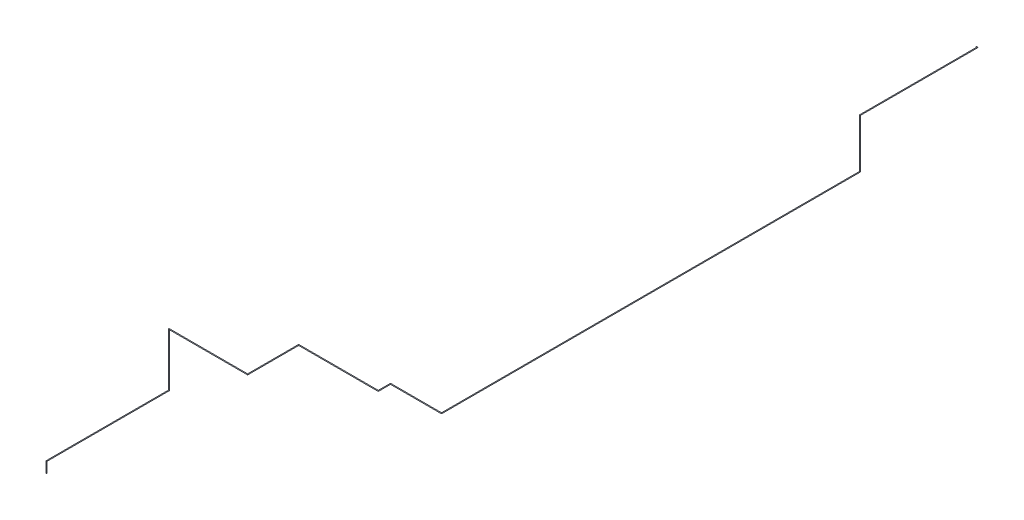
ISO-10303-21;
HEADER;
FILE_DESCRIPTION(('STEP AP214'),'2;1');
FILE_NAME('part.step','',(''),(''),'','','');
FILE_SCHEMA(('AUTOMOTIVE_DESIGN { 1 0 10303 214 1 1 1 1 }'));
ENDSEC;
DATA;
#1=APPLICATION_CONTEXT('core data for automotive mechanical design processes');
#2=APPLICATION_PROTOCOL_DEFINITION('international standard','automotive_design',2000,#1);
#3=PRODUCT_CONTEXT('',#1,'mechanical');
#4=PRODUCT('Part','Part','',(#3));
#5=PRODUCT_RELATED_PRODUCT_CATEGORY('part','',(#4));
#6=PRODUCT_DEFINITION_FORMATION('','',#4);
#7=PRODUCT_DEFINITION_CONTEXT('part definition',#1,'design');
#8=PRODUCT_DEFINITION('design','',#6,#7);
#9=PRODUCT_DEFINITION_SHAPE('','',#8);
#10=(LENGTH_UNIT() NAMED_UNIT(*) SI_UNIT(.MILLI.,.METRE.));
#11=(NAMED_UNIT(*) PLANE_ANGLE_UNIT() SI_UNIT($,.RADIAN.));
#12=(NAMED_UNIT(*) SI_UNIT($,.STERADIAN.) SOLID_ANGLE_UNIT());
#13=UNCERTAINTY_MEASURE_WITH_UNIT(LENGTH_MEASURE(1.E-05),#10,'distance_accuracy_value','');
#14=(GEOMETRIC_REPRESENTATION_CONTEXT(3) GLOBAL_UNCERTAINTY_ASSIGNED_CONTEXT((#13)) GLOBAL_UNIT_ASSIGNED_CONTEXT((#10,
#11,#12)) REPRESENTATION_CONTEXT('',''));
#15=CARTESIAN_POINT('',(0.,0.,0.));
#16=DIRECTION('',(0.,0.,1.));
#17=DIRECTION('',(1.,0.,0.));
#18=AXIS2_PLACEMENT_3D('',#15,#16,#17);
#19=CARTESIAN_POINT('',(0.,20.,0.));
#20=DIRECTION('',(0.,-1.,0.));
#21=DIRECTION('',(0.,0.,-1.));
#22=AXIS2_PLACEMENT_3D('',#19,#20,#21);
#23=CYLINDRICAL_SURFACE('',#22,12.7);
#24=CARTESIAN_POINT('',(0.,20.,0.));
#25=DIRECTION('',(0.,1.,0.));
#26=DIRECTION('',(0.,0.,1.));
#27=AXIS2_PLACEMENT_3D('',#24,#25,#26);
#28=CIRCLE('',#27,12.7);
#29=CARTESIAN_POINT('',(0.,20.,12.7));
#30=VERTEX_POINT('',#29);
#31=EDGE_CURVE('E41',#30,#30,#28,.T.);
#32=ORIENTED_EDGE('',*,*,#31,.F.);
#33=EDGE_LOOP('',(#32));
#34=FACE_BOUND('',#33,.T.);
#35=CARTESIAN_POINT('',(0.,5.,0.));
#36=DIRECTION('',(0.,1.,0.));
#37=DIRECTION('',(0.,0.,1.));
#38=AXIS2_PLACEMENT_3D('',#35,#36,#37);
#39=CIRCLE('',#38,12.7);
#40=CARTESIAN_POINT('',(-0.255798865635346,5.,12.6974236339637));
#41=VERTEX_POINT('',#40);
#42=CARTESIAN_POINT('',(0.255798865635346,5.,12.6974236339637));
#43=VERTEX_POINT('',#42);
#44=EDGE_CURVE('E11',#41,#43,#39,.T.);
#45=ORIENTED_EDGE('',*,*,#44,.T.);
#46=DIRECTION('',(0.,-1.,0.));
#47=VECTOR('',#46,1.);
#48=CARTESIAN_POINT('',(0.255798865635346,20.,12.6974236339637));
#49=LINE('',#48,#47);
#50=CARTESIAN_POINT('',(0.255798865635346,0.,12.6974236339637));
#51=VERTEX_POINT('',#50);
#52=EDGE_CURVE('E116',#43,#51,#49,.T.);
#53=ORIENTED_EDGE('',*,*,#52,.T.);
#54=CARTESIAN_POINT('',(0.,0.,0.));
#55=DIRECTION('',(0.,1.,0.));
#56=DIRECTION('',(0.,0.,1.));
#57=AXIS2_PLACEMENT_3D('',#54,#55,#56);
#58=CIRCLE('',#57,12.7);
#59=CARTESIAN_POINT('',(-0.255798865635346,0.,12.6974236339637));
#60=VERTEX_POINT('',#59);
#61=EDGE_CURVE('E152',#51,#60,#58,.T.);
#62=ORIENTED_EDGE('',*,*,#61,.T.);
#63=DIRECTION('',(0.,-1.,0.));
#64=VECTOR('',#63,1.);
#65=CARTESIAN_POINT('',(-0.255798865635346,20.,12.6974236339637));
#66=LINE('',#65,#64);
#67=EDGE_CURVE('E51',#60,#41,#66,.F.);
#68=ORIENTED_EDGE('',*,*,#67,.T.);
#69=EDGE_LOOP('',(#45,#53,#62,#68));
#70=FACE_BOUND('',#69,.T.);
#71=ADVANCED_FACE('F34',(#34,#70),#23,.T.);
#72=CARTESIAN_POINT('',(0.,0.,0.));
#73=DIRECTION('',(0.,1.,0.));
#74=DIRECTION('',(0.,0.,1.));
#75=AXIS2_PLACEMENT_3D('',#72,#73,#74);
#76=PLANE('',#75);
#77=ORIENTED_EDGE('',*,*,#61,.F.);
#78=DIRECTION('',(0.,0.,1.));
#79=VECTOR('',#78,1.);
#80=CARTESIAN_POINT('',(0.255798865635346,0.,12.4823290449341));
#81=LINE('',#80,#79);
#82=CARTESIAN_POINT('',(0.255798865635346,0.,12.9176709550659));
#83=VERTEX_POINT('',#82);
#84=EDGE_CURVE('E136',#51,#83,#81,.T.);
#85=ORIENTED_EDGE('',*,*,#84,.T.);
#86=DIRECTION('',(-1.,0.,0.));
#87=VECTOR('',#86,1.);
#88=CARTESIAN_POINT('',(-0.255798865635346,0.,12.9176709550659));
#89=LINE('',#88,#87);
#90=CARTESIAN_POINT('',(-0.255798865635346,0.,12.9176709550659));
#91=VERTEX_POINT('',#90);
#92=EDGE_CURVE('E126',#83,#91,#89,.T.);
#93=ORIENTED_EDGE('',*,*,#92,.T.);
#94=DIRECTION('',(0.,0.,-1.));
#95=VECTOR('',#94,1.);
#96=CARTESIAN_POINT('',(-0.255798865635346,0.,12.4823290449341));
#97=LINE('',#96,#95);
#98=EDGE_CURVE('E120',#91,#60,#97,.T.);
#99=ORIENTED_EDGE('',*,*,#98,.T.);
#100=EDGE_LOOP('',(#77,#85,#93,#99));
#101=FACE_BOUND('',#100,.T.);
#102=ADVANCED_FACE('F188',(#101),#76,.F.);
#103=CARTESIAN_POINT('',(10210.,5520.,-35355.));
#104=DIRECTION('',(-1.,0.,0.));
#105=DIRECTION('',(0.,0.,-1.));
#106=AXIS2_PLACEMENT_3D('',#103,#104,#105);
#107=PLANE('',#106);
#108=CARTESIAN_POINT('',(10210.,5520.,-35355.));
#109=DIRECTION('',(-1.,0.,0.));
#110=DIRECTION('',(0.,0.,-1.));
#111=AXIS2_PLACEMENT_3D('',#108,#109,#110);
#112=CIRCLE('',#111,17.5);
#113=CARTESIAN_POINT('',(10210.,5520.,-35372.5));
#114=VERTEX_POINT('',#113);
#115=EDGE_CURVE('E144',#114,#114,#112,.T.);
#116=ORIENTED_EDGE('',*,*,#115,.T.);
#117=EDGE_LOOP('',(#116));
#118=FACE_BOUND('',#117,.T.);
#119=ADVANCED_FACE('F190',(#118),#107,.T.);
#120=CARTESIAN_POINT('',(0.,20.,0.));
#121=DIRECTION('',(0.,1.,0.));
#122=DIRECTION('',(0.,0.,1.));
#123=AXIS2_PLACEMENT_3D('',#120,#121,#122);
#124=PLANE('',#123);
#125=ORIENTED_EDGE('',*,*,#31,.T.);
#126=EDGE_LOOP('',(#125));
#127=FACE_BOUND('',#126,.T.);
#128=CARTESIAN_POINT('',(0.,20.,0.));
#129=DIRECTION('',(0.,1.,0.));
#130=DIRECTION('',(0.,0.,1.));
#131=AXIS2_PLACEMENT_3D('',#128,#129,#130);
#132=CIRCLE('',#131,17.5);
#133=CARTESIAN_POINT('',(0.,20.,17.5));
#134=VERTEX_POINT('',#133);
#135=EDGE_CURVE('E145',#134,#134,#132,.T.);
#136=ORIENTED_EDGE('',*,*,#135,.F.);
#137=EDGE_LOOP('',(#136));
#138=FACE_BOUND('',#137,.T.);
#139=ADVANCED_FACE('F196',(#127,#138),#124,.F.);
#140=CARTESIAN_POINT('',(10269.35,5520.,-35355.));
#141=DIRECTION('',(-1.,0.,0.));
#142=DIRECTION('',(0.,0.,1.));
#143=AXIS2_PLACEMENT_3D('',#140,#141,#142);
#144=CYLINDRICAL_SURFACE('',#143,17.5);
#145=CARTESIAN_POINT('',(10250.,5520.,-35355.));
#146=DIRECTION('',(-0.707106781186548,0.,-0.707106781186548));
#147=DIRECTION('',(0.707106781186548,0.,-0.707106781186548));
#148=AXIS2_PLACEMENT_3D('',#145,#146,#147);
#149=ELLIPSE('',#148,24.7487373415292,17.5);
#150=CARTESIAN_POINT('',(10267.5,5520.,-35372.5));
#151=VERTEX_POINT('',#150);
#152=EDGE_CURVE('E179',#151,#151,#149,.F.);
#153=ORIENTED_EDGE('',*,*,#152,.F.);
#154=EDGE_LOOP('',(#153));
#155=FACE_BOUND('',#154,.T.);
#156=ORIENTED_EDGE('',*,*,#115,.F.);
#157=EDGE_LOOP('',(#156));
#158=FACE_BOUND('',#157,.T.);
#159=ADVANCED_FACE('F249',(#155,#158),#144,.T.);
#160=CARTESIAN_POINT('',(10250.,5520.,-29566.4));
#161=DIRECTION('',(0.,0.,-1.));
#162=DIRECTION('',(-1.,0.,0.));
#163=AXIS2_PLACEMENT_3D('',#160,#161,#162);
#164=CYLINDRICAL_SURFACE('',#163,17.5);
#165=CARTESIAN_POINT('',(10250.,5520.,-29605.));
#166=DIRECTION('',(0.,0.707106781186547,-0.707106781186547));
#167=DIRECTION('',(0.,0.707106781186548,0.707106781186548));
#168=AXIS2_PLACEMENT_3D('',#165,#166,#167);
#169=ELLIPSE('',#168,24.7487373415292,17.5);
#170=CARTESIAN_POINT('',(10250.,5537.5,-29587.5));
#171=VERTEX_POINT('',#170);
#172=EDGE_CURVE('E176',#171,#171,#169,.F.);
#173=ORIENTED_EDGE('',*,*,#172,.F.);
#174=EDGE_LOOP('',(#173));
#175=FACE_BOUND('',#174,.T.);
#176=ORIENTED_EDGE('',*,*,#152,.T.);
#177=EDGE_LOOP('',(#176));
#178=FACE_BOUND('',#177,.T.);
#179=ADVANCED_FACE('F245',(#175,#178),#164,.T.);
#180=CARTESIAN_POINT('',(10250.,3081.4,-29605.));
#181=DIRECTION('',(0.,1.,0.));
#182=DIRECTION('',(0.,0.,1.));
#183=AXIS2_PLACEMENT_3D('',#180,#181,#182);
#184=CYLINDRICAL_SURFACE('',#183,17.5);
#185=CARTESIAN_POINT('',(10250.,3120.,-29605.));
#186=DIRECTION('',(0.,0.707106781186547,-0.707106781186547));
#187=DIRECTION('',(0.,-0.707106781186548,-0.707106781186548));
#188=AXIS2_PLACEMENT_3D('',#185,#186,#187);
#189=ELLIPSE('',#188,24.7487373415292,17.5);
#190=CARTESIAN_POINT('',(10250.,3102.5,-29622.5));
#191=VERTEX_POINT('',#190);
#192=EDGE_CURVE('E173',#191,#191,#189,.F.);
#193=ORIENTED_EDGE('',*,*,#192,.F.);
#194=EDGE_LOOP('',(#193));
#195=FACE_BOUND('',#194,.T.);
#196=ORIENTED_EDGE('',*,*,#172,.T.);
#197=EDGE_LOOP('',(#196));
#198=FACE_BOUND('',#197,.T.);
#199=ADVANCED_FACE('F241',(#195,#198),#184,.T.);
#200=CARTESIAN_POINT('',(10250.,3120.,-9085.65));
#201=DIRECTION('',(0.,0.,-1.));
#202=DIRECTION('',(-1.,0.,0.));
#203=AXIS2_PLACEMENT_3D('',#200,#201,#202);
#204=CYLINDRICAL_SURFACE('',#203,17.5);
#205=CARTESIAN_POINT('',(10250.,3120.,-9104.99999999999));
#206=DIRECTION('',(0.707106781186547,0.,-0.707106781186547));
#207=DIRECTION('',(0.707106781186548,0.,0.707106781186548));
#208=AXIS2_PLACEMENT_3D('',#205,#206,#207);
#209=ELLIPSE('',#208,24.7487373415292,17.5);
#210=CARTESIAN_POINT('',(10267.5,3120.,-9087.49999999999));
#211=VERTEX_POINT('',#210);
#212=EDGE_CURVE('E170',#211,#211,#209,.F.);
#213=ORIENTED_EDGE('',*,*,#212,.F.);
#214=EDGE_LOOP('',(#213));
#215=FACE_BOUND('',#214,.T.);
#216=ORIENTED_EDGE('',*,*,#192,.T.);
#217=EDGE_LOOP('',(#216));
#218=FACE_BOUND('',#217,.T.);
#219=ADVANCED_FACE('F237',(#215,#218),#204,.T.);
#220=CARTESIAN_POINT('',(7730.65000000001,3120.,-9104.99999999999));
#221=DIRECTION('',(1.,0.,0.));
#222=DIRECTION('',(0.,0.,-1.));
#223=AXIS2_PLACEMENT_3D('',#220,#221,#222);
#224=CYLINDRICAL_SURFACE('',#223,17.5);
#225=CARTESIAN_POINT('',(7750.,3120.,-9104.99999999999));
#226=DIRECTION('',(0.707106781186548,0.,-0.707106781186548));
#227=DIRECTION('',(-0.707106781186548,0.,-0.707106781186548));
#228=AXIS2_PLACEMENT_3D('',#225,#226,#227);
#229=ELLIPSE('',#228,24.7487373415292,17.5);
#230=CARTESIAN_POINT('',(7732.5,3120.,-9122.49999999999));
#231=VERTEX_POINT('',#230);
#232=EDGE_CURVE('E167',#231,#231,#229,.F.);
#233=ORIENTED_EDGE('',*,*,#232,.F.);
#234=EDGE_LOOP('',(#233));
#235=FACE_BOUND('',#234,.T.);
#236=ORIENTED_EDGE('',*,*,#212,.T.);
#237=EDGE_LOOP('',(#236));
#238=FACE_BOUND('',#237,.T.);
#239=ADVANCED_FACE('F233',(#235,#238),#224,.T.);
#240=CARTESIAN_POINT('',(7750.,3120.,-8485.65));
#241=DIRECTION('',(0.,0.,-1.));
#242=DIRECTION('',(-1.,0.,0.));
#243=AXIS2_PLACEMENT_3D('',#240,#241,#242);
#244=CYLINDRICAL_SURFACE('',#243,17.5);
#245=CARTESIAN_POINT('',(7750.,3120.,-8505.));
#246=DIRECTION('',(0.707106781186548,0.,-0.707106781186548));
#247=DIRECTION('',(0.707106781186548,0.,0.707106781186548));
#248=AXIS2_PLACEMENT_3D('',#245,#246,#247);
#249=ELLIPSE('',#248,24.7487373415292,17.5);
#250=CARTESIAN_POINT('',(7767.5,3120.,-8487.49999999999));
#251=VERTEX_POINT('',#250);
#252=EDGE_CURVE('E164',#251,#251,#249,.F.);
#253=ORIENTED_EDGE('',*,*,#252,.F.);
#254=EDGE_LOOP('',(#253));
#255=FACE_BOUND('',#254,.T.);
#256=ORIENTED_EDGE('',*,*,#232,.T.);
#257=EDGE_LOOP('',(#256));
#258=FACE_BOUND('',#257,.T.);
#259=ADVANCED_FACE('F229',(#255,#258),#244,.T.);
#260=CARTESIAN_POINT('',(3830.65,3120.,-8505.));
#261=DIRECTION('',(1.,0.,0.));
#262=DIRECTION('',(0.,0.,-1.));
#263=AXIS2_PLACEMENT_3D('',#260,#261,#262);
#264=CYLINDRICAL_SURFACE('',#263,17.5);
#265=CARTESIAN_POINT('',(3850.,3120.,-8505.));
#266=DIRECTION('',(0.707106781186547,0.,-0.707106781186547));
#267=DIRECTION('',(-0.707106781186548,0.,-0.707106781186548));
#268=AXIS2_PLACEMENT_3D('',#265,#266,#267);
#269=ELLIPSE('',#268,24.7487373415292,17.5);
#270=CARTESIAN_POINT('',(3832.5,3120.,-8522.5));
#271=VERTEX_POINT('',#270);
#272=EDGE_CURVE('E161',#271,#271,#269,.F.);
#273=ORIENTED_EDGE('',*,*,#272,.F.);
#274=EDGE_LOOP('',(#273));
#275=FACE_BOUND('',#274,.T.);
#276=ORIENTED_EDGE('',*,*,#252,.T.);
#277=EDGE_LOOP('',(#276));
#278=FACE_BOUND('',#277,.T.);
#279=ADVANCED_FACE('F225',(#275,#278),#264,.T.);
#280=CARTESIAN_POINT('',(3850.,3120.,-5985.65));
#281=DIRECTION('',(0.,0.,-1.));
#282=DIRECTION('',(-1.,0.,0.));
#283=AXIS2_PLACEMENT_3D('',#280,#281,#282);
#284=CYLINDRICAL_SURFACE('',#283,17.5);
#285=CARTESIAN_POINT('',(3850.,3120.,-6005.));
#286=DIRECTION('',(0.707106781186547,0.,-0.707106781186547));
#287=DIRECTION('',(0.707106781186548,0.,0.707106781186548));
#288=AXIS2_PLACEMENT_3D('',#285,#286,#287);
#289=ELLIPSE('',#288,24.7487373415292,17.5);
#290=CARTESIAN_POINT('',(3867.5,3120.,-5987.5));
#291=VERTEX_POINT('',#290);
#292=EDGE_CURVE('E158',#291,#291,#289,.F.);
#293=ORIENTED_EDGE('',*,*,#292,.F.);
#294=EDGE_LOOP('',(#293));
#295=FACE_BOUND('',#294,.T.);
#296=ORIENTED_EDGE('',*,*,#272,.T.);
#297=EDGE_LOOP('',(#296));
#298=FACE_BOUND('',#297,.T.);
#299=ADVANCED_FACE('F221',(#295,#298),#284,.T.);
#300=CARTESIAN_POINT('',(-38.5999999999996,3120.,-6005.));
#301=DIRECTION('',(1.,0.,0.));
#302=DIRECTION('',(0.,0.,-1.));
#303=AXIS2_PLACEMENT_3D('',#300,#301,#302);
#304=CYLINDRICAL_SURFACE('',#303,17.5);
#305=CARTESIAN_POINT('',(0.,3120.,-6005.));
#306=DIRECTION('',(0.707106781186547,0.707106781186547,0.));
#307=DIRECTION('',(-0.707106781186548,0.707106781186548,0.));
#308=AXIS2_PLACEMENT_3D('',#305,#306,#307);
#309=ELLIPSE('',#308,24.7487373415292,17.5);
#310=CARTESIAN_POINT('',(-17.5,3137.5,-6005.));
#311=VERTEX_POINT('',#310);
#312=EDGE_CURVE('E155',#311,#311,#309,.F.);
#313=ORIENTED_EDGE('',*,*,#312,.F.);
#314=EDGE_LOOP('',(#313));
#315=FACE_BOUND('',#314,.T.);
#316=ORIENTED_EDGE('',*,*,#292,.T.);
#317=EDGE_LOOP('',(#316));
#318=FACE_BOUND('',#317,.T.);
#319=ADVANCED_FACE('F217',(#315,#318),#304,.T.);
#320=CARTESIAN_POINT('',(0.,500.650000000001,-6005.));
#321=DIRECTION('',(0.,1.,0.));
#322=DIRECTION('',(0.,0.,1.));
#323=AXIS2_PLACEMENT_3D('',#320,#321,#322);
#324=CYLINDRICAL_SURFACE('',#323,17.5);
#325=CARTESIAN_POINT('',(0.,520.,-6005.));
#326=DIRECTION('',(0.,0.707106781186547,-0.707106781186547));
#327=DIRECTION('',(0.,-0.707106781186548,-0.707106781186548));
#328=AXIS2_PLACEMENT_3D('',#325,#326,#327);
#329=ELLIPSE('',#328,24.7487373415292,17.5);
#330=CARTESIAN_POINT('',(0.,502.5,-6022.5));
#331=VERTEX_POINT('',#330);
#332=EDGE_CURVE('E149',#331,#331,#329,.F.);
#333=ORIENTED_EDGE('',*,*,#332,.F.);
#334=EDGE_LOOP('',(#333));
#335=FACE_BOUND('',#334,.T.);
#336=ORIENTED_EDGE('',*,*,#312,.T.);
#337=EDGE_LOOP('',(#336));
#338=FACE_BOUND('',#337,.T.);
#339=ADVANCED_FACE('F209',(#335,#338),#324,.T.);
#340=CARTESIAN_POINT('',(0.,520.,19.3499999999998));
#341=DIRECTION('',(0.,0.,-1.));
#342=DIRECTION('',(-1.,0.,0.));
#343=AXIS2_PLACEMENT_3D('',#340,#341,#342);
#344=CYLINDRICAL_SURFACE('',#343,17.5);
#345=CARTESIAN_POINT('',(0.,520.,0.));
#346=DIRECTION('',(0.,0.707106781186548,-0.707106781186548));
#347=DIRECTION('',(0.,0.707106781186548,0.707106781186548));
#348=AXIS2_PLACEMENT_3D('',#345,#346,#347);
#349=ELLIPSE('',#348,24.7487373415292,17.5);
#350=CARTESIAN_POINT('',(0.,537.5,17.5));
#351=VERTEX_POINT('',#350);
#352=EDGE_CURVE('E148',#351,#351,#349,.F.);
#353=ORIENTED_EDGE('',*,*,#352,.F.);
#354=EDGE_LOOP('',(#353));
#355=FACE_BOUND('',#354,.T.);
#356=ORIENTED_EDGE('',*,*,#332,.T.);
#357=EDGE_LOOP('',(#356));
#358=FACE_BOUND('',#357,.T.);
#359=ADVANCED_FACE('F201',(#355,#358),#344,.T.);
#360=CARTESIAN_POINT('',(0.,20.,0.));
#361=DIRECTION('',(0.,1.,0.));
#362=DIRECTION('',(0.,0.,1.));
#363=AXIS2_PLACEMENT_3D('',#360,#361,#362);
#364=CYLINDRICAL_SURFACE('',#363,17.5);
#365=ORIENTED_EDGE('',*,*,#135,.T.);
#366=EDGE_LOOP('',(#365));
#367=FACE_BOUND('',#366,.T.);
#368=ORIENTED_EDGE('',*,*,#352,.T.);
#369=EDGE_LOOP('',(#368));
#370=FACE_BOUND('',#369,.T.);
#371=ADVANCED_FACE('F191',(#367,#370),#364,.T.);
#372=CARTESIAN_POINT('',(0.255798865635346,5.,12.4823290449341));
#373=DIRECTION('',(1.,0.,0.));
#374=DIRECTION('',(0.,0.,-1.));
#375=AXIS2_PLACEMENT_3D('',#372,#373,#374);
#376=PLANE('',#375);
#377=ORIENTED_EDGE('',*,*,#52,.F.);
#378=DIRECTION('',(0.,0.,1.));
#379=VECTOR('',#378,1.);
#380=CARTESIAN_POINT('',(0.255798865635346,5.,12.4823290449341));
#381=LINE('',#380,#379);
#382=CARTESIAN_POINT('',(0.255798865635346,5.,12.9176709550659));
#383=VERTEX_POINT('',#382);
#384=EDGE_CURVE('E110',#43,#383,#381,.T.);
#385=ORIENTED_EDGE('',*,*,#384,.T.);
#386=DIRECTION('',(0.,-1.,0.));
#387=VECTOR('',#386,1.);
#388=CARTESIAN_POINT('',(0.255798865635346,5.,12.9176709550659));
#389=LINE('',#388,#387);
#390=EDGE_CURVE('E114',#383,#83,#389,.T.);
#391=ORIENTED_EDGE('',*,*,#390,.T.);
#392=ORIENTED_EDGE('',*,*,#84,.F.);
#393=EDGE_LOOP('',(#377,#385,#391,#392));
#394=FACE_BOUND('',#393,.T.);
#395=ADVANCED_FACE('F112',(#394),#376,.T.);
#396=CARTESIAN_POINT('',(-0.255798865635346,5.,12.4823290449341));
#397=DIRECTION('',(-1.,0.,0.));
#398=DIRECTION('',(0.,0.,1.));
#399=AXIS2_PLACEMENT_3D('',#396,#397,#398);
#400=PLANE('',#399);
#401=ORIENTED_EDGE('',*,*,#67,.F.);
#402=ORIENTED_EDGE('',*,*,#98,.F.);
#403=DIRECTION('',(0.,-1.,0.));
#404=VECTOR('',#403,1.);
#405=CARTESIAN_POINT('',(-0.255798865635346,5.,12.9176709550659));
#406=LINE('',#405,#404);
#407=CARTESIAN_POINT('',(-0.255798865635346,5.,12.9176709550659));
#408=VERTEX_POINT('',#407);
#409=EDGE_CURVE('E127',#408,#91,#406,.T.);
#410=ORIENTED_EDGE('',*,*,#409,.F.);
#411=DIRECTION('',(0.,0.,-1.));
#412=VECTOR('',#411,1.);
#413=CARTESIAN_POINT('',(-0.255798865635346,5.,12.4823290449341));
#414=LINE('',#413,#412);
#415=EDGE_CURVE('E128',#408,#41,#414,.T.);
#416=ORIENTED_EDGE('',*,*,#415,.T.);
#417=EDGE_LOOP('',(#401,#402,#410,#416));
#418=FACE_BOUND('',#417,.T.);
#419=ADVANCED_FACE('F187',(#418),#400,.T.);
#420=CARTESIAN_POINT('',(-0.255798865635346,5.,12.9176709550659));
#421=DIRECTION('',(0.,0.,1.));
#422=DIRECTION('',(1.,0.,0.));
#423=AXIS2_PLACEMENT_3D('',#420,#421,#422);
#424=PLANE('',#423);
#425=ORIENTED_EDGE('',*,*,#92,.F.);
#426=ORIENTED_EDGE('',*,*,#390,.F.);
#427=DIRECTION('',(-1.,0.,0.));
#428=VECTOR('',#427,1.);
#429=CARTESIAN_POINT('',(-0.255798865635346,5.,12.9176709550659));
#430=LINE('',#429,#428);
#431=EDGE_CURVE('E119',#383,#408,#430,.T.);
#432=ORIENTED_EDGE('',*,*,#431,.T.);
#433=ORIENTED_EDGE('',*,*,#409,.T.);
#434=EDGE_LOOP('',(#425,#426,#432,#433));
#435=FACE_BOUND('',#434,.T.);
#436=ADVANCED_FACE('F124',(#435),#424,.T.);
#437=CARTESIAN_POINT('',(0.,5.,0.));
#438=DIRECTION('',(0.,1.,0.));
#439=DIRECTION('',(0.,0.,1.));
#440=AXIS2_PLACEMENT_3D('',#437,#438,#439);
#441=PLANE('',#440);
#442=ORIENTED_EDGE('',*,*,#44,.F.);
#443=ORIENTED_EDGE('',*,*,#415,.F.);
#444=ORIENTED_EDGE('',*,*,#431,.F.);
#445=ORIENTED_EDGE('',*,*,#384,.F.);
#446=EDGE_LOOP('',(#442,#443,#444,#445));
#447=FACE_BOUND('',#446,.T.);
#448=ADVANCED_FACE('F131',(#447),#441,.T.);
#449=CLOSED_SHELL('',(#71,#102,#119,#139,#159,#179,#199,#219,#239,#259,#279,#299,#319,#339,#359,
#371,#395,#419,#436,#448));
#450=MANIFOLD_SOLID_BREP('B2',#449);
#451=ADVANCED_BREP_SHAPE_REPRESENTATION('',(#18,#450),#14);
#452=SHAPE_DEFINITION_REPRESENTATION(#9,#451);
ENDSEC;
END-ISO-10303-21;
